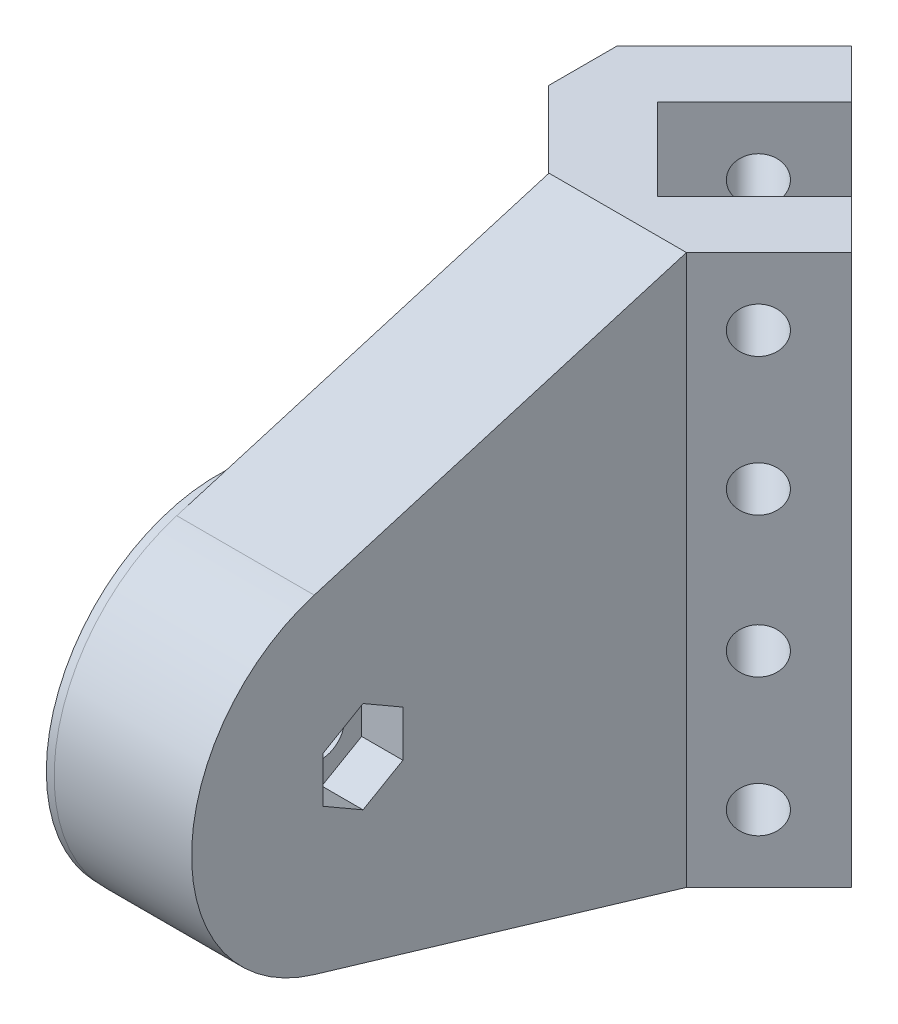
ISO-10303-21;
HEADER;
FILE_DESCRIPTION(('STEP AP214'),'2;1');
FILE_NAME('part.step','',(''),(''),'','','');
FILE_SCHEMA(('AUTOMOTIVE_DESIGN { 1 0 10303 214 1 1 1 1 }'));
ENDSEC;
DATA;
#1=APPLICATION_CONTEXT('core data for automotive mechanical design processes');
#2=APPLICATION_PROTOCOL_DEFINITION('international standard','automotive_design',2000,#1);
#3=PRODUCT_CONTEXT('',#1,'mechanical');
#4=PRODUCT('Part','Part','',(#3));
#5=PRODUCT_RELATED_PRODUCT_CATEGORY('part','',(#4));
#6=PRODUCT_DEFINITION_FORMATION('','',#4);
#7=PRODUCT_DEFINITION_CONTEXT('part definition',#1,'design');
#8=PRODUCT_DEFINITION('design','',#6,#7);
#9=PRODUCT_DEFINITION_SHAPE('','',#8);
#10=(LENGTH_UNIT() NAMED_UNIT(*) SI_UNIT(.MILLI.,.METRE.));
#11=(NAMED_UNIT(*) PLANE_ANGLE_UNIT() SI_UNIT($,.RADIAN.));
#12=(NAMED_UNIT(*) SI_UNIT($,.STERADIAN.) SOLID_ANGLE_UNIT());
#13=UNCERTAINTY_MEASURE_WITH_UNIT(LENGTH_MEASURE(1.E-05),#10,'distance_accuracy_value','');
#14=(GEOMETRIC_REPRESENTATION_CONTEXT(3) GLOBAL_UNCERTAINTY_ASSIGNED_CONTEXT((#13)) GLOBAL_UNIT_ASSIGNED_CONTEXT((#10,
#11,#12)) REPRESENTATION_CONTEXT('',''));
#15=CARTESIAN_POINT('',(0.,0.,0.));
#16=DIRECTION('',(0.,0.,1.));
#17=DIRECTION('',(1.,0.,0.));
#18=AXIS2_PLACEMENT_3D('',#15,#16,#17);
#19=CARTESIAN_POINT('',(250.719484138599,34.9,80.4212229501447));
#20=DIRECTION('',(0.707106781186549,0.,0.707106781186546));
#21=DIRECTION('',(0.707106781186546,0.,-0.707106781186549));
#22=AXIS2_PLACEMENT_3D('',#19,#20,#21);
#23=CYLINDRICAL_SURFACE('',#22,1.65);
#24=CARTESIAN_POINT('',(260.618979075211,34.9,90.3207178867563));
#25=DIRECTION('',(0.707106781186549,0.,0.707106781186546));
#26=DIRECTION('',(0.707106781186546,0.,-0.707106781186549));
#27=AXIS2_PLACEMENT_3D('',#24,#25,#26);
#28=CIRCLE('',#27,1.65);
#29=CARTESIAN_POINT('',(261.785705264169,34.9,89.1539916977985));
#30=VERTEX_POINT('',#29);
#31=EDGE_CURVE('E379',#30,#30,#28,.T.);
#32=ORIENTED_EDGE('',*,*,#31,.F.);
#33=EDGE_LOOP('',(#32));
#34=FACE_BOUND('',#33,.T.);
#35=CARTESIAN_POINT('',(264.154512981144,34.9,93.8562517926891));
#36=DIRECTION('',(0.707106781186549,0.,0.707106781186546));
#37=DIRECTION('',(0.707106781186546,0.,-0.707106781186549));
#38=AXIS2_PLACEMENT_3D('',#35,#36,#37);
#39=CIRCLE('',#38,1.65);
#40=CARTESIAN_POINT('',(265.321239170101,34.9,92.6895256037313));
#41=VERTEX_POINT('',#40);
#42=EDGE_CURVE('E351',#41,#41,#39,.T.);
#43=ORIENTED_EDGE('',*,*,#42,.T.);
#44=EDGE_LOOP('',(#43));
#45=FACE_BOUND('',#44,.T.);
#46=ADVANCED_FACE('F17',(#34,#45),#23,.F.);
#47=CARTESIAN_POINT('',(250.719484138599,44.9,80.4212229501447));
#48=DIRECTION('',(0.707106781186549,0.,0.707106781186546));
#49=DIRECTION('',(0.707106781186546,0.,-0.707106781186549));
#50=AXIS2_PLACEMENT_3D('',#47,#48,#49);
#51=CYLINDRICAL_SURFACE('',#50,1.65);
#52=CARTESIAN_POINT('',(260.618979075211,44.9,90.3207178867563));
#53=DIRECTION('',(0.707106781186549,0.,0.707106781186546));
#54=DIRECTION('',(0.707106781186546,0.,-0.707106781186549));
#55=AXIS2_PLACEMENT_3D('',#52,#53,#54);
#56=CIRCLE('',#55,1.65);
#57=CARTESIAN_POINT('',(261.785705264169,44.9,89.1539916977985));
#58=VERTEX_POINT('',#57);
#59=EDGE_CURVE('E382',#58,#58,#56,.T.);
#60=ORIENTED_EDGE('',*,*,#59,.F.);
#61=EDGE_LOOP('',(#60));
#62=FACE_BOUND('',#61,.T.);
#63=CARTESIAN_POINT('',(264.154512981144,44.9,93.8562517926891));
#64=DIRECTION('',(0.707106781186549,0.,0.707106781186546));
#65=DIRECTION('',(0.707106781186546,0.,-0.707106781186549));
#66=AXIS2_PLACEMENT_3D('',#63,#64,#65);
#67=CIRCLE('',#66,1.65);
#68=CARTESIAN_POINT('',(265.321239170101,44.9,92.6895256037313));
#69=VERTEX_POINT('',#68);
#70=EDGE_CURVE('E347',#69,#69,#67,.T.);
#71=ORIENTED_EDGE('',*,*,#70,.T.);
#72=EDGE_LOOP('',(#71));
#73=FACE_BOUND('',#72,.T.);
#74=ADVANCED_FACE('F630',(#62,#73),#51,.F.);
#75=CARTESIAN_POINT('',(250.719484138599,55.1,80.4212229501447));
#76=DIRECTION('',(0.707106781186549,0.,0.707106781186546));
#77=DIRECTION('',(0.707106781186546,0.,-0.707106781186549));
#78=AXIS2_PLACEMENT_3D('',#75,#76,#77);
#79=CYLINDRICAL_SURFACE('',#78,1.65);
#80=CARTESIAN_POINT('',(260.618979075211,55.1,90.3207178867563));
#81=DIRECTION('',(0.707106781186549,0.,0.707106781186546));
#82=DIRECTION('',(0.707106781186546,0.,-0.707106781186549));
#83=AXIS2_PLACEMENT_3D('',#80,#81,#82);
#84=CIRCLE('',#83,1.65);
#85=CARTESIAN_POINT('',(261.785705264169,55.1,89.1539916977985));
#86=VERTEX_POINT('',#85);
#87=EDGE_CURVE('E451',#86,#86,#84,.T.);
#88=ORIENTED_EDGE('',*,*,#87,.F.);
#89=EDGE_LOOP('',(#88));
#90=FACE_BOUND('',#89,.T.);
#91=CARTESIAN_POINT('',(264.154512981144,55.1,93.8562517926891));
#92=DIRECTION('',(0.707106781186549,0.,0.707106781186546));
#93=DIRECTION('',(0.707106781186546,0.,-0.707106781186549));
#94=AXIS2_PLACEMENT_3D('',#91,#92,#93);
#95=CIRCLE('',#94,1.65);
#96=CARTESIAN_POINT('',(265.321239170101,55.1,92.6895256037313));
#97=VERTEX_POINT('',#96);
#98=EDGE_CURVE('E350',#97,#97,#95,.T.);
#99=ORIENTED_EDGE('',*,*,#98,.T.);
#100=EDGE_LOOP('',(#99));
#101=FACE_BOUND('',#100,.T.);
#102=ADVANCED_FACE('F614',(#90,#101),#79,.F.);
#103=CARTESIAN_POINT('',(250.719484138599,65.1,80.4212229501447));
#104=DIRECTION('',(0.707106781186549,0.,0.707106781186546));
#105=DIRECTION('',(0.707106781186546,0.,-0.707106781186549));
#106=AXIS2_PLACEMENT_3D('',#103,#104,#105);
#107=CYLINDRICAL_SURFACE('',#106,1.65);
#108=CARTESIAN_POINT('',(260.618979075211,65.1,90.3207178867563));
#109=DIRECTION('',(0.707106781186549,0.,0.707106781186546));
#110=DIRECTION('',(0.707106781186546,0.,-0.707106781186549));
#111=AXIS2_PLACEMENT_3D('',#108,#109,#110);
#112=CIRCLE('',#111,1.65);
#113=CARTESIAN_POINT('',(261.785705264169,65.1,89.1539916977985));
#114=VERTEX_POINT('',#113);
#115=EDGE_CURVE('E475',#114,#114,#112,.T.);
#116=ORIENTED_EDGE('',*,*,#115,.F.);
#117=EDGE_LOOP('',(#116));
#118=FACE_BOUND('',#117,.T.);
#119=CARTESIAN_POINT('',(264.154512981144,65.1,93.8562517926891));
#120=DIRECTION('',(0.707106781186549,0.,0.707106781186546));
#121=DIRECTION('',(0.707106781186546,0.,-0.707106781186549));
#122=AXIS2_PLACEMENT_3D('',#119,#120,#121);
#123=CIRCLE('',#122,1.65);
#124=CARTESIAN_POINT('',(265.321239170101,65.1,92.6895256037313));
#125=VERTEX_POINT('',#124);
#126=EDGE_CURVE('E414',#125,#125,#123,.T.);
#127=ORIENTED_EDGE('',*,*,#126,.T.);
#128=EDGE_LOOP('',(#127));
#129=FACE_BOUND('',#128,.T.);
#130=ADVANCED_FACE('F610',(#118,#129),#107,.F.);
#131=CARTESIAN_POINT('',(250.719484138599,34.9,80.4212229501447));
#132=DIRECTION('',(0.707106781186549,0.,0.707106781186546));
#133=DIRECTION('',(0.707106781186546,0.,-0.707106781186549));
#134=AXIS2_PLACEMENT_3D('',#131,#132,#133);
#135=CYLINDRICAL_SURFACE('',#134,1.65);
#136=CARTESIAN_POINT('',(254.679282113244,34.9,84.3810209247893));
#137=DIRECTION('',(-0.707106781186549,0.,-0.707106781186546));
#138=DIRECTION('',(-0.707106781186546,0.,0.707106781186549));
#139=AXIS2_PLACEMENT_3D('',#136,#137,#138);
#140=CIRCLE('',#139,1.65);
#141=CARTESIAN_POINT('',(253.512555924286,34.9,85.5477471137471));
#142=VERTEX_POINT('',#141);
#143=EDGE_CURVE('E21',#142,#142,#140,.T.);
#144=ORIENTED_EDGE('',*,*,#143,.F.);
#145=EDGE_LOOP('',(#144));
#146=FACE_BOUND('',#145,.T.);
#147=CARTESIAN_POINT('',(251.143748207311,34.9,80.8454870188566));
#148=DIRECTION('',(0.707106781186548,0.,0.707106781186547));
#149=DIRECTION('',(0.707106781186547,0.,-0.707106781186548));
#150=AXIS2_PLACEMENT_3D('',#147,#148,#149);
#151=CIRCLE('',#150,1.65);
#152=CARTESIAN_POINT('',(252.310474396269,34.9,79.6787608298988));
#153=VERTEX_POINT('',#152);
#154=EDGE_CURVE('E440',#153,#153,#151,.T.);
#155=ORIENTED_EDGE('',*,*,#154,.F.);
#156=EDGE_LOOP('',(#155));
#157=FACE_BOUND('',#156,.T.);
#158=ADVANCED_FACE('F613',(#146,#157),#135,.F.);
#159=CARTESIAN_POINT('',(250.719484138599,44.9,80.4212229501447));
#160=DIRECTION('',(0.707106781186549,0.,0.707106781186546));
#161=DIRECTION('',(0.707106781186546,0.,-0.707106781186549));
#162=AXIS2_PLACEMENT_3D('',#159,#160,#161);
#163=CYLINDRICAL_SURFACE('',#162,1.65);
#164=CARTESIAN_POINT('',(254.679282113244,44.9,84.3810209247893));
#165=DIRECTION('',(-0.707106781186549,0.,-0.707106781186546));
#166=DIRECTION('',(-0.707106781186546,0.,0.707106781186549));
#167=AXIS2_PLACEMENT_3D('',#164,#165,#166);
#168=CIRCLE('',#167,1.65);
#169=CARTESIAN_POINT('',(253.512555924286,44.9,85.5477471137471));
#170=VERTEX_POINT('',#169);
#171=EDGE_CURVE('E384',#170,#170,#168,.T.);
#172=ORIENTED_EDGE('',*,*,#171,.F.);
#173=EDGE_LOOP('',(#172));
#174=FACE_BOUND('',#173,.T.);
#175=CARTESIAN_POINT('',(251.143748207311,44.9,80.8454870188566));
#176=DIRECTION('',(0.707106781186548,0.,0.707106781186547));
#177=DIRECTION('',(0.707106781186547,0.,-0.707106781186548));
#178=AXIS2_PLACEMENT_3D('',#175,#176,#177);
#179=CIRCLE('',#178,1.65);
#180=CARTESIAN_POINT('',(252.310474396269,44.9,79.6787608298988));
#181=VERTEX_POINT('',#180);
#182=EDGE_CURVE('E436',#181,#181,#179,.T.);
#183=ORIENTED_EDGE('',*,*,#182,.F.);
#184=EDGE_LOOP('',(#183));
#185=FACE_BOUND('',#184,.T.);
#186=ADVANCED_FACE('F698',(#174,#185),#163,.F.);
#187=CARTESIAN_POINT('',(250.719484138599,55.1,80.4212229501447));
#188=DIRECTION('',(0.707106781186549,0.,0.707106781186546));
#189=DIRECTION('',(0.707106781186546,0.,-0.707106781186549));
#190=AXIS2_PLACEMENT_3D('',#187,#188,#189);
#191=CYLINDRICAL_SURFACE('',#190,1.65);
#192=CARTESIAN_POINT('',(254.679282113244,55.1,84.3810209247893));
#193=DIRECTION('',(-0.707106781186549,0.,-0.707106781186546));
#194=DIRECTION('',(-0.707106781186546,0.,0.707106781186549));
#195=AXIS2_PLACEMENT_3D('',#192,#193,#194);
#196=CIRCLE('',#195,1.65);
#197=CARTESIAN_POINT('',(253.512555924286,55.1,85.5477471137471));
#198=VERTEX_POINT('',#197);
#199=EDGE_CURVE('E387',#198,#198,#196,.T.);
#200=ORIENTED_EDGE('',*,*,#199,.F.);
#201=EDGE_LOOP('',(#200));
#202=FACE_BOUND('',#201,.T.);
#203=CARTESIAN_POINT('',(251.143748207311,55.1,80.8454870188566));
#204=DIRECTION('',(0.707106781186548,0.,0.707106781186547));
#205=DIRECTION('',(0.707106781186547,0.,-0.707106781186548));
#206=AXIS2_PLACEMENT_3D('',#203,#204,#205);
#207=CIRCLE('',#206,1.65);
#208=CARTESIAN_POINT('',(252.310474396269,55.1,79.6787608298988));
#209=VERTEX_POINT('',#208);
#210=EDGE_CURVE('E439',#209,#209,#207,.T.);
#211=ORIENTED_EDGE('',*,*,#210,.F.);
#212=EDGE_LOOP('',(#211));
#213=FACE_BOUND('',#212,.T.);
#214=ADVANCED_FACE('F712',(#202,#213),#191,.F.);
#215=CARTESIAN_POINT('',(250.719484138599,65.1,80.4212229501447));
#216=DIRECTION('',(0.707106781186549,0.,0.707106781186546));
#217=DIRECTION('',(0.707106781186546,0.,-0.707106781186549));
#218=AXIS2_PLACEMENT_3D('',#215,#216,#217);
#219=CYLINDRICAL_SURFACE('',#218,1.65);
#220=CARTESIAN_POINT('',(254.679282113244,65.1,84.3810209247893));
#221=DIRECTION('',(-0.707106781186549,0.,-0.707106781186546));
#222=DIRECTION('',(-0.707106781186546,0.,0.707106781186549));
#223=AXIS2_PLACEMENT_3D('',#220,#221,#222);
#224=CIRCLE('',#223,1.65);
#225=CARTESIAN_POINT('',(253.512555924286,65.1,85.5477471137471));
#226=VERTEX_POINT('',#225);
#227=EDGE_CURVE('E398',#226,#226,#224,.T.);
#228=ORIENTED_EDGE('',*,*,#227,.F.);
#229=EDGE_LOOP('',(#228));
#230=FACE_BOUND('',#229,.T.);
#231=CARTESIAN_POINT('',(251.143748207311,65.1,80.8454870188566));
#232=DIRECTION('',(0.707106781186548,0.,0.707106781186547));
#233=DIRECTION('',(0.707106781186547,0.,-0.707106781186548));
#234=AXIS2_PLACEMENT_3D('',#231,#232,#233);
#235=CIRCLE('',#234,1.65);
#236=CARTESIAN_POINT('',(252.310474396269,65.1,79.6787608298988));
#237=VERTEX_POINT('',#236);
#238=EDGE_CURVE('E512',#237,#237,#235,.T.);
#239=ORIENTED_EDGE('',*,*,#238,.F.);
#240=EDGE_LOOP('',(#239));
#241=FACE_BOUND('',#240,.T.);
#242=ADVANCED_FACE('F714',(#230,#241),#219,.F.);
#243=CARTESIAN_POINT('',(258.537860757007,52.5114736709749,118.55));
#244=DIRECTION('',(0.,0.866025403784438,-0.5));
#245=DIRECTION('',(-1.,0.,0.));
#246=AXIS2_PLACEMENT_3D('',#243,#244,#245);
#247=PLANE('',#246);
#248=DIRECTION('',(0.,0.5,0.866025403784438));
#249=VECTOR('',#248,1.);
#250=CARTESIAN_POINT('',(261.537860757007,52.5114736709749,118.55));
#251=LINE('',#250,#249);
#252=CARTESIAN_POINT('',(261.537860757007,51.6743157806499,117.1));
#253=VERTEX_POINT('',#252);
#254=CARTESIAN_POINT('',(261.537860757007,53.3486315612998,120.));
#255=VERTEX_POINT('',#254);
#256=EDGE_CURVE('E404',#253,#255,#251,.T.);
#257=ORIENTED_EDGE('',*,*,#256,.T.);
#258=DIRECTION('',(1.,0.,0.));
#259=VECTOR('',#258,1.);
#260=CARTESIAN_POINT('',(258.537860757007,53.3486315612998,120.));
#261=LINE('',#260,#259);
#262=CARTESIAN_POINT('',(258.537860757007,53.3486315612998,120.));
#263=VERTEX_POINT('',#262);
#264=EDGE_CURVE('E187',#263,#255,#261,.T.);
#265=ORIENTED_EDGE('',*,*,#264,.F.);
#266=DIRECTION('',(0.,0.5,0.866025403784438));
#267=VECTOR('',#266,1.);
#268=CARTESIAN_POINT('',(258.537860757007,52.5114736709749,118.55));
#269=LINE('',#268,#267);
#270=CARTESIAN_POINT('',(258.537860757007,51.6743157806499,117.1));
#271=VERTEX_POINT('',#270);
#272=EDGE_CURVE('E354',#271,#263,#269,.T.);
#273=ORIENTED_EDGE('',*,*,#272,.F.);
#274=DIRECTION('',(1.,0.,0.));
#275=VECTOR('',#274,1.);
#276=CARTESIAN_POINT('',(258.537860757007,51.6743157806499,117.1));
#277=LINE('',#276,#275);
#278=EDGE_CURVE('E11',#271,#253,#277,.T.);
#279=ORIENTED_EDGE('',*,*,#278,.T.);
#280=EDGE_LOOP('',(#257,#265,#273,#279));
#281=FACE_BOUND('',#280,.T.);
#282=ADVANCED_FACE('F19',(#281),#247,.F.);
#283=CARTESIAN_POINT('',(258.537860757007,50.,117.1));
#284=DIRECTION('',(0.,0.,-1.));
#285=DIRECTION('',(0.,-1.,0.));
#286=AXIS2_PLACEMENT_3D('',#283,#284,#285);
#287=PLANE('',#286);
#288=DIRECTION('',(0.,1.,0.));
#289=VECTOR('',#288,1.);
#290=CARTESIAN_POINT('',(261.537860757007,50.,117.1));
#291=LINE('',#290,#289);
#292=CARTESIAN_POINT('',(261.537860757007,48.3256842193501,117.1));
#293=VERTEX_POINT('',#292);
#294=EDGE_CURVE('E407',#293,#253,#291,.T.);
#295=ORIENTED_EDGE('',*,*,#294,.T.);
#296=ORIENTED_EDGE('',*,*,#278,.F.);
#297=DIRECTION('',(0.,1.,0.));
#298=VECTOR('',#297,1.);
#299=CARTESIAN_POINT('',(258.537860757007,50.,117.1));
#300=LINE('',#299,#298);
#301=CARTESIAN_POINT('',(258.537860757007,48.3256842193501,117.1));
#302=VERTEX_POINT('',#301);
#303=EDGE_CURVE('E356',#302,#271,#300,.T.);
#304=ORIENTED_EDGE('',*,*,#303,.F.);
#305=DIRECTION('',(1.,0.,0.));
#306=VECTOR('',#305,1.);
#307=CARTESIAN_POINT('',(258.537860757007,48.3256842193501,117.1));
#308=LINE('',#307,#306);
#309=EDGE_CURVE('E28',#302,#293,#308,.T.);
#310=ORIENTED_EDGE('',*,*,#309,.T.);
#311=EDGE_LOOP('',(#295,#296,#304,#310));
#312=FACE_BOUND('',#311,.T.);
#313=ADVANCED_FACE('F688',(#312),#287,.F.);
#314=CARTESIAN_POINT('',(258.537860757007,47.4885263290251,118.55));
#315=DIRECTION('',(0.,-0.866025403784439,-0.5));
#316=DIRECTION('',(0.,0.5,-0.866025403784439));
#317=AXIS2_PLACEMENT_3D('',#314,#315,#316);
#318=PLANE('',#317);
#319=DIRECTION('',(0.,0.5,-0.866025403784439));
#320=VECTOR('',#319,1.);
#321=CARTESIAN_POINT('',(261.537860757007,47.4885263290251,118.55));
#322=LINE('',#321,#320);
#323=CARTESIAN_POINT('',(261.537860757007,46.6513684387002,120.));
#324=VERTEX_POINT('',#323);
#325=EDGE_CURVE('E535',#324,#293,#322,.T.);
#326=ORIENTED_EDGE('',*,*,#325,.T.);
#327=ORIENTED_EDGE('',*,*,#309,.F.);
#328=DIRECTION('',(0.,0.5,-0.866025403784439));
#329=VECTOR('',#328,1.);
#330=CARTESIAN_POINT('',(258.537860757007,47.4885263290251,118.55));
#331=LINE('',#330,#329);
#332=CARTESIAN_POINT('',(258.537860757007,46.6513684387002,120.));
#333=VERTEX_POINT('',#332);
#334=EDGE_CURVE('E402',#333,#302,#331,.T.);
#335=ORIENTED_EDGE('',*,*,#334,.F.);
#336=DIRECTION('',(1.,0.,0.));
#337=VECTOR('',#336,1.);
#338=CARTESIAN_POINT('',(258.537860757007,46.6513684387002,120.));
#339=LINE('',#338,#337);
#340=EDGE_CURVE('E119',#333,#324,#339,.T.);
#341=ORIENTED_EDGE('',*,*,#340,.T.);
#342=EDGE_LOOP('',(#326,#327,#335,#341));
#343=FACE_BOUND('',#342,.T.);
#344=ADVANCED_FACE('F691',(#343),#318,.F.);
#345=CARTESIAN_POINT('',(258.537860757007,47.4885263290251,121.45));
#346=DIRECTION('',(0.,-0.866025403784438,0.5));
#347=DIRECTION('',(-1.,0.,0.));
#348=AXIS2_PLACEMENT_3D('',#345,#346,#347);
#349=PLANE('',#348);
#350=DIRECTION('',(0.,-0.5,-0.866025403784438));
#351=VECTOR('',#350,1.);
#352=CARTESIAN_POINT('',(261.537860757007,47.4885263290251,121.45));
#353=LINE('',#352,#351);
#354=CARTESIAN_POINT('',(261.537860757007,48.3256842193501,122.9));
#355=VERTEX_POINT('',#354);
#356=EDGE_CURVE('E467',#355,#324,#353,.T.);
#357=ORIENTED_EDGE('',*,*,#356,.T.);
#358=ORIENTED_EDGE('',*,*,#340,.F.);
#359=DIRECTION('',(0.,-0.5,-0.866025403784438));
#360=VECTOR('',#359,1.);
#361=CARTESIAN_POINT('',(258.537860757007,47.4885263290251,121.45));
#362=LINE('',#361,#360);
#363=CARTESIAN_POINT('',(258.537860757007,48.3256842193501,122.9));
#364=VERTEX_POINT('',#363);
#365=EDGE_CURVE('E399',#364,#333,#362,.T.);
#366=ORIENTED_EDGE('',*,*,#365,.F.);
#367=DIRECTION('',(1.,0.,0.));
#368=VECTOR('',#367,1.);
#369=CARTESIAN_POINT('',(258.537860757007,48.3256842193501,122.9));
#370=LINE('',#369,#368);
#371=EDGE_CURVE('E277',#364,#355,#370,.T.);
#372=ORIENTED_EDGE('',*,*,#371,.T.);
#373=EDGE_LOOP('',(#357,#358,#366,#372));
#374=FACE_BOUND('',#373,.T.);
#375=ADVANCED_FACE('F672',(#374),#349,.F.);
#376=CARTESIAN_POINT('',(258.537860757007,50.,122.9));
#377=DIRECTION('',(0.,0.,1.));
#378=DIRECTION('',(1.,0.,0.));
#379=AXIS2_PLACEMENT_3D('',#376,#377,#378);
#380=PLANE('',#379);
#381=DIRECTION('',(0.,-1.,0.));
#382=VECTOR('',#381,1.);
#383=CARTESIAN_POINT('',(261.537860757007,50.,122.9));
#384=LINE('',#383,#382);
#385=CARTESIAN_POINT('',(261.537860757007,51.6743157806499,122.9));
#386=VERTEX_POINT('',#385);
#387=EDGE_CURVE('E417',#386,#355,#384,.T.);
#388=ORIENTED_EDGE('',*,*,#387,.T.);
#389=ORIENTED_EDGE('',*,*,#371,.F.);
#390=DIRECTION('',(0.,-1.,0.));
#391=VECTOR('',#390,1.);
#392=CARTESIAN_POINT('',(258.537860757007,50.,122.9));
#393=LINE('',#392,#391);
#394=CARTESIAN_POINT('',(258.537860757007,51.6743157806499,122.9));
#395=VERTEX_POINT('',#394);
#396=EDGE_CURVE('E372',#395,#364,#393,.T.);
#397=ORIENTED_EDGE('',*,*,#396,.F.);
#398=DIRECTION('',(1.,0.,0.));
#399=VECTOR('',#398,1.);
#400=CARTESIAN_POINT('',(258.537860757007,51.6743157806499,122.9));
#401=LINE('',#400,#399);
#402=EDGE_CURVE('E175',#395,#386,#401,.T.);
#403=ORIENTED_EDGE('',*,*,#402,.T.);
#404=EDGE_LOOP('',(#388,#389,#397,#403));
#405=FACE_BOUND('',#404,.T.);
#406=ADVANCED_FACE('F669',(#405),#380,.F.);
#407=CARTESIAN_POINT('',(258.537860757007,52.5114736709749,121.45));
#408=DIRECTION('',(0.,0.866025403784439,0.5));
#409=DIRECTION('',(1.,0.,0.));
#410=AXIS2_PLACEMENT_3D('',#407,#408,#409);
#411=PLANE('',#410);
#412=DIRECTION('',(0.,-0.5,0.866025403784439));
#413=VECTOR('',#412,1.);
#414=CARTESIAN_POINT('',(261.537860757007,52.5114736709749,121.45));
#415=LINE('',#414,#413);
#416=EDGE_CURVE('E408',#255,#386,#415,.T.);
#417=ORIENTED_EDGE('',*,*,#416,.T.);
#418=ORIENTED_EDGE('',*,*,#402,.F.);
#419=DIRECTION('',(0.,-0.5,0.866025403784439));
#420=VECTOR('',#419,1.);
#421=CARTESIAN_POINT('',(258.537860757007,52.5114736709749,121.45));
#422=LINE('',#421,#420);
#423=EDGE_CURVE('E368',#263,#395,#422,.T.);
#424=ORIENTED_EDGE('',*,*,#423,.F.);
#425=ORIENTED_EDGE('',*,*,#264,.T.);
#426=EDGE_LOOP('',(#417,#418,#424,#425));
#427=FACE_BOUND('',#426,.T.);
#428=ADVANCED_FACE('F654',(#427),#411,.F.);
#429=CARTESIAN_POINT('',(258.537860757007,50.,114.472904016826));
#430=DIRECTION('',(1.,0.,0.));
#431=DIRECTION('',(0.,1.,0.));
#432=AXIS2_PLACEMENT_3D('',#429,#430,#431);
#433=PLANE('',#432);
#434=CARTESIAN_POINT('',(258.537860757007,50.,120.));
#435=DIRECTION('',(-1.,0.,0.));
#436=DIRECTION('',(0.,0.,-1.));
#437=AXIS2_PLACEMENT_3D('',#434,#435,#436);
#438=CIRCLE('',#437,1.65);
#439=CARTESIAN_POINT('',(258.537860757007,50.,118.35));
#440=VERTEX_POINT('',#439);
#441=EDGE_CURVE('E332',#440,#440,#438,.T.);
#442=ORIENTED_EDGE('',*,*,#441,.T.);
#443=EDGE_LOOP('',(#442));
#444=FACE_BOUND('',#443,.T.);
#445=ORIENTED_EDGE('',*,*,#423,.T.);
#446=ORIENTED_EDGE('',*,*,#396,.T.);
#447=ORIENTED_EDGE('',*,*,#365,.T.);
#448=ORIENTED_EDGE('',*,*,#334,.T.);
#449=ORIENTED_EDGE('',*,*,#303,.T.);
#450=ORIENTED_EDGE('',*,*,#272,.T.);
#451=EDGE_LOOP('',(#445,#446,#447,#448,#449,#450));
#452=FACE_BOUND('',#451,.T.);
#453=ADVANCED_FACE('F650',(#444,#452),#433,.T.);
#454=CARTESIAN_POINT('',(250.937860757007,50.,114.497673148926));
#455=DIRECTION('',(-1.,0.,0.));
#456=DIRECTION('',(0.,0.,1.));
#457=AXIS2_PLACEMENT_3D('',#454,#455,#456);
#458=PLANE('',#457);
#459=CARTESIAN_POINT('',(250.937860757007,50.,120.));
#460=DIRECTION('',(-1.,0.,0.));
#461=DIRECTION('',(0.,0.,1.));
#462=AXIS2_PLACEMENT_3D('',#459,#460,#461);
#463=CIRCLE('',#462,12.4407289921999);
#464=CARTESIAN_POINT('',(250.937860757007,50.,132.4407289922));
#465=VERTEX_POINT('',#464);
#466=EDGE_CURVE('E373',#465,#465,#463,.T.);
#467=ORIENTED_EDGE('',*,*,#466,.T.);
#468=EDGE_LOOP('',(#467));
#469=FACE_BOUND('',#468,.T.);
#470=CARTESIAN_POINT('',(250.937860757007,50.,120.));
#471=DIRECTION('',(-1.,0.,0.));
#472=DIRECTION('',(0.,0.,1.));
#473=AXIS2_PLACEMENT_3D('',#470,#471,#472);
#474=CIRCLE('',#473,1.65);
#475=CARTESIAN_POINT('',(250.937860757007,50.,121.65));
#476=VERTEX_POINT('',#475);
#477=EDGE_CURVE('E338',#476,#476,#474,.T.);
#478=ORIENTED_EDGE('',*,*,#477,.F.);
#479=EDGE_LOOP('',(#478));
#480=FACE_BOUND('',#479,.T.);
#481=ADVANCED_FACE('F653',(#469,#480),#458,.T.);
#482=CARTESIAN_POINT('',(250.937860757007,50.,120.));
#483=DIRECTION('',(1.,0.,0.));
#484=DIRECTION('',(0.,0.,-1.));
#485=AXIS2_PLACEMENT_3D('',#482,#483,#484);
#486=CYLINDRICAL_SURFACE('',#485,12.4407289921999);
#487=CARTESIAN_POINT('',(251.537860757007,50.,120.));
#488=DIRECTION('',(-1.,0.,0.));
#489=DIRECTION('',(0.,0.,1.));
#490=AXIS2_PLACEMENT_3D('',#487,#488,#489);
#491=CIRCLE('',#490,12.4407289921999);
#492=CARTESIAN_POINT('',(251.537860757007,50.,132.4407289922));
#493=VERTEX_POINT('',#492);
#494=EDGE_CURVE('E456',#493,#493,#491,.T.);
#495=ORIENTED_EDGE('',*,*,#494,.T.);
#496=EDGE_LOOP('',(#495));
#497=FACE_BOUND('',#496,.T.);
#498=ORIENTED_EDGE('',*,*,#466,.F.);
#499=EDGE_LOOP('',(#498));
#500=FACE_BOUND('',#499,.T.);
#501=ADVANCED_FACE('F649',(#497,#500),#486,.T.);
#502=CARTESIAN_POINT('',(236.537860757007,65.9782873032583,110.012237629748));
#503=DIRECTION('',(0.,0.958603913762746,0.284742930586075));
#504=DIRECTION('',(1.,0.,0.));
#505=AXIS2_PLACEMENT_3D('',#502,#503,#504);
#506=PLANE('',#505);
#507=DIRECTION('',(0.692007175158167,-0.205553251152171,0.692007175158167));
#508=VECTOR('',#507,1.);
#509=CARTESIAN_POINT('',(247.927196919652,71.0577938576369,92.9117784436719));
#510=LINE('',#509,#508);
#511=CARTESIAN_POINT('',(251.488322492806,70.,96.4729040168261));
#512=VERTEX_POINT('',#511);
#513=CARTESIAN_POINT('',(251.537860757007,69.9852851941015,96.5224422810265));
#514=VERTEX_POINT('',#513);
#515=EDGE_CURVE('E305',#512,#514,#510,.T.);
#516=ORIENTED_EDGE('',*,*,#515,.T.);
#517=DIRECTION('',(0.,0.284742930586075,-0.958603913762746));
#518=VECTOR('',#517,1.);
#519=CARTESIAN_POINT('',(251.537860757007,65.0800367463449,113.036251246607));
#520=LINE('',#519,#518);
#521=CARTESIAN_POINT('',(251.537860757007,61.9565746065166,123.55157124267));
#522=VERTEX_POINT('',#521);
#523=EDGE_CURVE('E343',#522,#514,#520,.T.);
#524=ORIENTED_EDGE('',*,*,#523,.F.);
#525=DIRECTION('',(1.,0.,0.));
#526=VECTOR('',#525,1.);
#527=CARTESIAN_POINT('',(236.537860757007,61.9565746065166,123.55157124267));
#528=LINE('',#527,#526);
#529=CARTESIAN_POINT('',(261.537860757007,61.9565746065166,123.55157124267));
#530=VERTEX_POINT('',#529);
#531=EDGE_CURVE('E520',#522,#530,#528,.T.);
#532=ORIENTED_EDGE('',*,*,#531,.T.);
#533=DIRECTION('',(0.,-0.284742930586075,0.958603913762746));
#534=VECTOR('',#533,1.);
#535=CARTESIAN_POINT('',(261.537860757007,65.9782873032583,110.012237629748));
#536=LINE('',#535,#534);
#537=CARTESIAN_POINT('',(261.537860757007,70.,96.4729040168261));
#538=VERTEX_POINT('',#537);
#539=EDGE_CURVE('E307',#538,#530,#536,.T.);
#540=ORIENTED_EDGE('',*,*,#539,.F.);
#541=DIRECTION('',(1.,0.,0.));
#542=VECTOR('',#541,1.);
#543=CARTESIAN_POINT('',(236.537860757007,70.,96.4729040168261));
#544=LINE('',#543,#542);
#545=EDGE_CURVE('E300',#512,#538,#544,.T.);
#546=ORIENTED_EDGE('',*,*,#545,.F.);
#547=EDGE_LOOP('',(#516,#524,#532,#540,#546));
#548=FACE_BOUND('',#547,.T.);
#549=ADVANCED_FACE('F302',(#548),#506,.T.);
#550=CARTESIAN_POINT('',(236.537860757007,50.,120.));
#551=DIRECTION('',(1.,0.,0.));
#552=DIRECTION('',(0.,0.,-1.));
#553=AXIS2_PLACEMENT_3D('',#550,#551,#552);
#554=CYLINDRICAL_SURFACE('',#553,12.4729040168261);
#555=DIRECTION('',(1.,0.,0.));
#556=VECTOR('',#555,1.);
#557=CARTESIAN_POINT('',(236.537860757007,38.0434253934835,123.55157124267));
#558=LINE('',#557,#556);
#559=CARTESIAN_POINT('',(251.537860757007,38.0434253934835,123.55157124267));
#560=VERTEX_POINT('',#559);
#561=CARTESIAN_POINT('',(261.537860757007,38.0434253934835,123.55157124267));
#562=VERTEX_POINT('',#561);
#563=EDGE_CURVE('E517',#560,#562,#558,.T.);
#564=ORIENTED_EDGE('',*,*,#563,.T.);
#565=CARTESIAN_POINT('',(261.537860757007,50.,120.));
#566=DIRECTION('',(1.,0.,0.));
#567=DIRECTION('',(0.,0.,-1.));
#568=AXIS2_PLACEMENT_3D('',#565,#566,#567);
#569=CIRCLE('',#568,12.4729040168261);
#570=EDGE_CURVE('E421',#530,#562,#569,.T.);
#571=ORIENTED_EDGE('',*,*,#570,.F.);
#572=ORIENTED_EDGE('',*,*,#531,.F.);
#573=CARTESIAN_POINT('',(251.537860757007,50.,120.));
#574=DIRECTION('',(-1.,0.,0.));
#575=DIRECTION('',(0.,0.,1.));
#576=AXIS2_PLACEMENT_3D('',#573,#574,#575);
#577=CIRCLE('',#576,12.4729040168261);
#578=EDGE_CURVE('E346',#560,#522,#577,.T.);
#579=ORIENTED_EDGE('',*,*,#578,.F.);
#580=EDGE_LOOP('',(#564,#571,#572,#579));
#581=FACE_BOUND('',#580,.T.);
#582=ADVANCED_FACE('F648',(#581),#554,.T.);
#583=CARTESIAN_POINT('',(236.537860757007,34.0217126967417,110.012237629748));
#584=DIRECTION('',(0.,0.958603913762746,-0.284742930586075));
#585=DIRECTION('',(-1.,0.,0.));
#586=AXIS2_PLACEMENT_3D('',#583,#584,#585);
#587=PLANE('',#586);
#588=DIRECTION('',(1.,0.,0.));
#589=VECTOR('',#588,1.);
#590=CARTESIAN_POINT('',(236.537860757007,30.,96.4729040168261));
#591=LINE('',#590,#589);
#592=CARTESIAN_POINT('',(251.488322492806,30.,96.4729040168261));
#593=VERTEX_POINT('',#592);
#594=CARTESIAN_POINT('',(261.537860757007,30.,96.4729040168261));
#595=VERTEX_POINT('',#594);
#596=EDGE_CURVE('E448',#593,#595,#591,.T.);
#597=ORIENTED_EDGE('',*,*,#596,.T.);
#598=DIRECTION('',(0.,0.284742930586075,0.958603913762746));
#599=VECTOR('',#598,1.);
#600=CARTESIAN_POINT('',(261.537860757007,34.0217126967417,110.012237629748));
#601=LINE('',#600,#599);
#602=EDGE_CURVE('E425',#595,#562,#601,.T.);
#603=ORIENTED_EDGE('',*,*,#602,.T.);
#604=ORIENTED_EDGE('',*,*,#563,.F.);
#605=DIRECTION('',(0.,-0.284742930586075,-0.958603913762746));
#606=VECTOR('',#605,1.);
#607=CARTESIAN_POINT('',(251.537860757007,38.1631047144049,123.954478753651));
#608=LINE('',#607,#606);
#609=CARTESIAN_POINT('',(251.537860757007,30.0147148058985,96.5224422810265));
#610=VERTEX_POINT('',#609);
#611=EDGE_CURVE('E313',#560,#610,#608,.T.);
#612=ORIENTED_EDGE('',*,*,#611,.T.);
#613=DIRECTION('',(0.692007175158167,0.20555325115217,0.692007175158167));
#614=VECTOR('',#613,1.);
#615=CARTESIAN_POINT('',(253.616969906628,30.6322917047322,98.6015514306475));
#616=LINE('',#615,#614);
#617=EDGE_CURVE('E367',#593,#610,#616,.T.);
#618=ORIENTED_EDGE('',*,*,#617,.F.);
#619=EDGE_LOOP('',(#597,#603,#604,#612,#618));
#620=FACE_BOUND('',#619,.T.);
#621=ADVANCED_FACE('F663',(#620),#587,.F.);
#622=CARTESIAN_POINT('',(246.002326851074,70.,88.4869083750938));
#623=DIRECTION('',(1.,0.,0.));
#624=DIRECTION('',(0.,1.,0.));
#625=AXIS2_PLACEMENT_3D('',#622,#623,#624);
#626=PLANE('',#625);
#627=DIRECTION('',(0.,0.,1.));
#628=VECTOR('',#627,1.);
#629=CARTESIAN_POINT('',(246.002326851074,30.,88.4869083750938));
#630=LINE('',#629,#628);
#631=CARTESIAN_POINT('',(246.002326851074,30.,85.9869083750938));
#632=VERTEX_POINT('',#631);
#633=CARTESIAN_POINT('',(246.002326851074,30.,90.9869083750938));
#634=VERTEX_POINT('',#633);
#635=EDGE_CURVE('E378',#632,#634,#630,.T.);
#636=ORIENTED_EDGE('',*,*,#635,.T.);
#637=DIRECTION('',(0.,-1.,0.));
#638=VECTOR('',#637,1.);
#639=CARTESIAN_POINT('',(246.002326851074,70.,90.9869083750938));
#640=LINE('',#639,#638);
#641=CARTESIAN_POINT('',(246.002326851074,70.,90.9869083750938));
#642=VERTEX_POINT('',#641);
#643=EDGE_CURVE('E324',#642,#634,#640,.T.);
#644=ORIENTED_EDGE('',*,*,#643,.F.);
#645=DIRECTION('',(0.,0.,1.));
#646=VECTOR('',#645,1.);
#647=CARTESIAN_POINT('',(246.002326851074,70.,88.4869083750938));
#648=LINE('',#647,#646);
#649=CARTESIAN_POINT('',(246.002326851074,70.,85.9869083750938));
#650=VERTEX_POINT('',#649);
#651=EDGE_CURVE('E319',#650,#642,#648,.T.);
#652=ORIENTED_EDGE('',*,*,#651,.F.);
#653=DIRECTION('',(0.,-1.,0.));
#654=VECTOR('',#653,1.);
#655=CARTESIAN_POINT('',(246.002326851074,70.,85.9869083750938));
#656=LINE('',#655,#654);
#657=EDGE_CURVE('E288',#650,#632,#656,.T.);
#658=ORIENTED_EDGE('',*,*,#657,.T.);
#659=EDGE_LOOP('',(#636,#644,#652,#658));
#660=FACE_BOUND('',#659,.T.);
#661=ADVANCED_FACE('F668',(#660),#626,.F.);
#662=CARTESIAN_POINT('',(250.27009380404,70.,81.7191414221275));
#663=DIRECTION('',(0.707106781186548,0.,0.707106781186547));
#664=DIRECTION('',(0.,-1.,0.));
#665=AXIS2_PLACEMENT_3D('',#662,#663,#664);
#666=PLANE('',#665);
#667=DIRECTION('',(-0.707106781186547,0.,0.707106781186548));
#668=VECTOR('',#667,1.);
#669=CARTESIAN_POINT('',(250.27009380404,30.,81.7191414221275));
#670=LINE('',#669,#668);
#671=CARTESIAN_POINT('',(254.537860757007,30.,77.4513744691612));
#672=VERTEX_POINT('',#671);
#673=EDGE_CURVE('E374',#672,#632,#670,.T.);
#674=ORIENTED_EDGE('',*,*,#673,.T.);
#675=ORIENTED_EDGE('',*,*,#657,.F.);
#676=DIRECTION('',(-0.707106781186547,0.,0.707106781186548));
#677=VECTOR('',#676,1.);
#678=CARTESIAN_POINT('',(250.27009380404,70.,81.7191414221275));
#679=LINE('',#678,#677);
#680=CARTESIAN_POINT('',(254.537860757007,70.,77.4513744691612));
#681=VERTEX_POINT('',#680);
#682=EDGE_CURVE('E478',#681,#650,#679,.T.);
#683=ORIENTED_EDGE('',*,*,#682,.F.);
#684=DIRECTION('',(0.,-1.,0.));
#685=VECTOR('',#684,1.);
#686=CARTESIAN_POINT('',(254.537860757007,70.,77.4513744691612));
#687=LINE('',#686,#685);
#688=EDGE_CURVE('E397',#681,#672,#687,.T.);
#689=ORIENTED_EDGE('',*,*,#688,.T.);
#690=EDGE_LOOP('',(#674,#675,#683,#689));
#691=FACE_BOUND('',#690,.T.);
#692=ORIENTED_EDGE('',*,*,#238,.T.);
#693=EDGE_LOOP('',(#692));
#694=FACE_BOUND('',#693,.T.);
#695=ORIENTED_EDGE('',*,*,#210,.T.);
#696=EDGE_LOOP('',(#695));
#697=FACE_BOUND('',#696,.T.);
#698=ORIENTED_EDGE('',*,*,#182,.T.);
#699=EDGE_LOOP('',(#698));
#700=FACE_BOUND('',#699,.T.);
#701=ORIENTED_EDGE('',*,*,#154,.T.);
#702=EDGE_LOOP('',(#701));
#703=FACE_BOUND('',#702,.T.);
#704=ADVANCED_FACE('F665',(#691,#694,#697,#700,#703),#666,.F.);
#705=CARTESIAN_POINT('',(256.305627709973,70.,79.2191414221275));
#706=DIRECTION('',(-0.707106781186548,0.,0.707106781186548));
#707=DIRECTION('',(0.,1.,0.));
#708=AXIS2_PLACEMENT_3D('',#705,#706,#707);
#709=PLANE('',#708);
#710=DIRECTION('',(-0.707106781186548,0.,-0.707106781186548));
#711=VECTOR('',#710,1.);
#712=CARTESIAN_POINT('',(256.305627709973,30.,79.2191414221275));
#713=LINE('',#712,#711);
#714=CARTESIAN_POINT('',(258.073394662939,30.,80.9869083750939));
#715=VERTEX_POINT('',#714);
#716=EDGE_CURVE('E377',#715,#672,#713,.T.);
#717=ORIENTED_EDGE('',*,*,#716,.T.);
#718=ORIENTED_EDGE('',*,*,#688,.F.);
#719=DIRECTION('',(-0.707106781186548,0.,-0.707106781186548));
#720=VECTOR('',#719,1.);
#721=CARTESIAN_POINT('',(256.305627709973,70.,79.2191414221275));
#722=LINE('',#721,#720);
#723=CARTESIAN_POINT('',(258.073394662939,70.,80.9869083750939));
#724=VERTEX_POINT('',#723);
#725=EDGE_CURVE('E521',#724,#681,#722,.T.);
#726=ORIENTED_EDGE('',*,*,#725,.F.);
#727=DIRECTION('',(0.,-1.,0.));
#728=VECTOR('',#727,1.);
#729=CARTESIAN_POINT('',(258.073394662939,70.,80.9869083750939));
#730=LINE('',#729,#728);
#731=EDGE_CURVE('E394',#724,#715,#730,.T.);
#732=ORIENTED_EDGE('',*,*,#731,.T.);
#733=EDGE_LOOP('',(#717,#718,#726,#732));
#734=FACE_BOUND('',#733,.T.);
#735=ADVANCED_FACE('F577',(#734),#709,.F.);
#736=CARTESIAN_POINT('',(254.537860757007,70.,84.5224422810266));
#737=DIRECTION('',(-0.707106781186549,0.,-0.707106781186546));
#738=DIRECTION('',(-0.707106781186546,0.,0.707106781186549));
#739=AXIS2_PLACEMENT_3D('',#736,#737,#738);
#740=PLANE('',#739);
#741=DIRECTION('',(0.707106781186546,0.,-0.707106781186549));
#742=VECTOR('',#741,1.);
#743=CARTESIAN_POINT('',(254.537860757007,30.,84.5224422810266));
#744=LINE('',#743,#742);
#745=CARTESIAN_POINT('',(251.002326851074,30.,88.0579761869593));
#746=VERTEX_POINT('',#745);
#747=EDGE_CURVE('E508',#746,#715,#744,.T.);
#748=ORIENTED_EDGE('',*,*,#747,.T.);
#749=ORIENTED_EDGE('',*,*,#731,.F.);
#750=DIRECTION('',(0.707106781186546,0.,-0.707106781186549));
#751=VECTOR('',#750,1.);
#752=CARTESIAN_POINT('',(254.537860757007,70.,84.5224422810266));
#753=LINE('',#752,#751);
#754=CARTESIAN_POINT('',(251.002326851074,70.,88.0579761869593));
#755=VERTEX_POINT('',#754);
#756=EDGE_CURVE('E462',#755,#724,#753,.T.);
#757=ORIENTED_EDGE('',*,*,#756,.F.);
#758=DIRECTION('',(0.,-1.,0.));
#759=VECTOR('',#758,1.);
#760=CARTESIAN_POINT('',(251.002326851074,70.,88.0579761869593));
#761=LINE('',#760,#759);
#762=EDGE_CURVE('E432',#755,#746,#761,.T.);
#763=ORIENTED_EDGE('',*,*,#762,.T.);
#764=EDGE_LOOP('',(#748,#749,#757,#763));
#765=FACE_BOUND('',#764,.T.);
#766=ORIENTED_EDGE('',*,*,#227,.T.);
#767=EDGE_LOOP('',(#766));
#768=FACE_BOUND('',#767,.T.);
#769=ORIENTED_EDGE('',*,*,#199,.T.);
#770=EDGE_LOOP('',(#769));
#771=FACE_BOUND('',#770,.T.);
#772=ORIENTED_EDGE('',*,*,#171,.T.);
#773=EDGE_LOOP('',(#772));
#774=FACE_BOUND('',#773,.T.);
#775=ORIENTED_EDGE('',*,*,#143,.T.);
#776=EDGE_LOOP('',(#775));
#777=FACE_BOUND('',#776,.T.);
#778=ADVANCED_FACE('F571',(#765,#768,#771,#774,#777),#740,.F.);
#779=CARTESIAN_POINT('',(253.972175332058,70.,91.0278246679428));
#780=DIRECTION('',(-0.707106781186546,0.,0.707106781186549));
#781=DIRECTION('',(0.,1.,0.));
#782=AXIS2_PLACEMENT_3D('',#779,#780,#781);
#783=PLANE('',#782);
#784=DIRECTION('',(-0.707106781186549,0.,-0.707106781186546));
#785=VECTOR('',#784,1.);
#786=CARTESIAN_POINT('',(253.972175332058,30.,91.0278246679428));
#787=LINE('',#786,#785);
#788=CARTESIAN_POINT('',(256.942023813041,30.,93.9976731489263));
#789=VERTEX_POINT('',#788);
#790=EDGE_CURVE('E502',#789,#746,#787,.T.);
#791=ORIENTED_EDGE('',*,*,#790,.T.);
#792=ORIENTED_EDGE('',*,*,#762,.F.);
#793=DIRECTION('',(-0.707106781186549,0.,-0.707106781186546));
#794=VECTOR('',#793,1.);
#795=CARTESIAN_POINT('',(253.972175332058,70.,91.0278246679428));
#796=LINE('',#795,#794);
#797=CARTESIAN_POINT('',(256.942023813041,70.,93.9976731489263));
#798=VERTEX_POINT('',#797);
#799=EDGE_CURVE('E431',#798,#755,#796,.T.);
#800=ORIENTED_EDGE('',*,*,#799,.F.);
#801=DIRECTION('',(0.,-1.,0.));
#802=VECTOR('',#801,1.);
#803=CARTESIAN_POINT('',(256.942023813041,70.,93.9976731489263));
#804=LINE('',#803,#802);
#805=EDGE_CURVE('E435',#798,#789,#804,.T.);
#806=ORIENTED_EDGE('',*,*,#805,.T.);
#807=EDGE_LOOP('',(#791,#792,#800,#806));
#808=FACE_BOUND('',#807,.T.);
#809=ADVANCED_FACE('F658',(#808),#783,.F.);
#810=CARTESIAN_POINT('',(260.477557718974,70.,90.4621392429936));
#811=DIRECTION('',(0.707106781186549,0.,0.707106781186546));
#812=DIRECTION('',(0.,-1.,0.));
#813=AXIS2_PLACEMENT_3D('',#810,#811,#812);
#814=PLANE('',#813);
#815=DIRECTION('',(-0.707106781186546,0.,0.707106781186549));
#816=VECTOR('',#815,1.);
#817=CARTESIAN_POINT('',(260.477557718974,30.,90.4621392429936));
#818=LINE('',#817,#816);
#819=CARTESIAN_POINT('',(264.013091624906,30.,86.9266053370609));
#820=VERTEX_POINT('',#819);
#821=EDGE_CURVE('E393',#820,#789,#818,.T.);
#822=ORIENTED_EDGE('',*,*,#821,.T.);
#823=ORIENTED_EDGE('',*,*,#805,.F.);
#824=DIRECTION('',(-0.707106781186546,0.,0.707106781186549));
#825=VECTOR('',#824,1.);
#826=CARTESIAN_POINT('',(260.477557718974,70.,90.4621392429936));
#827=LINE('',#826,#825);
#828=CARTESIAN_POINT('',(264.013091624906,70.,86.9266053370609));
#829=VERTEX_POINT('',#828);
#830=EDGE_CURVE('E362',#829,#798,#827,.T.);
#831=ORIENTED_EDGE('',*,*,#830,.F.);
#832=DIRECTION('',(0.,-1.,0.));
#833=VECTOR('',#832,1.);
#834=CARTESIAN_POINT('',(264.013091624906,70.,86.9266053370609));
#835=LINE('',#834,#833);
#836=EDGE_CURVE('E383',#829,#820,#835,.T.);
#837=ORIENTED_EDGE('',*,*,#836,.T.);
#838=EDGE_LOOP('',(#822,#823,#831,#837));
#839=FACE_BOUND('',#838,.T.);
#840=ORIENTED_EDGE('',*,*,#115,.T.);
#841=EDGE_LOOP('',(#840));
#842=FACE_BOUND('',#841,.T.);
#843=ORIENTED_EDGE('',*,*,#87,.T.);
#844=EDGE_LOOP('',(#843));
#845=FACE_BOUND('',#844,.T.);
#846=ORIENTED_EDGE('',*,*,#59,.T.);
#847=EDGE_LOOP('',(#846));
#848=FACE_BOUND('',#847,.T.);
#849=ORIENTED_EDGE('',*,*,#31,.T.);
#850=EDGE_LOOP('',(#849));
#851=FACE_BOUND('',#850,.T.);
#852=ADVANCED_FACE('F488',(#839,#842,#845,#848,#851),#814,.F.);
#853=CARTESIAN_POINT('',(265.780858577873,70.,88.6943722900273));
#854=DIRECTION('',(-0.707106781186545,0.,0.70710678118655));
#855=DIRECTION('',(0.,1.,0.));
#856=AXIS2_PLACEMENT_3D('',#853,#854,#855);
#857=PLANE('',#856);
#858=DIRECTION('',(-0.70710678118655,0.,-0.707106781186545));
#859=VECTOR('',#858,1.);
#860=CARTESIAN_POINT('',(265.780858577873,30.,88.6943722900273));
#861=LINE('',#860,#859);
#862=CARTESIAN_POINT('',(267.548625530839,30.,90.4621392429936));
#863=VERTEX_POINT('',#862);
#864=EDGE_CURVE('E388',#863,#820,#861,.T.);
#865=ORIENTED_EDGE('',*,*,#864,.T.);
#866=ORIENTED_EDGE('',*,*,#836,.F.);
#867=DIRECTION('',(-0.70710678118655,0.,-0.707106781186545));
#868=VECTOR('',#867,1.);
#869=CARTESIAN_POINT('',(265.780858577873,70.,88.6943722900273));
#870=LINE('',#869,#868);
#871=CARTESIAN_POINT('',(267.548625530839,70.,90.4621392429936));
#872=VERTEX_POINT('',#871);
#873=EDGE_CURVE('E358',#872,#829,#870,.T.);
#874=ORIENTED_EDGE('',*,*,#873,.F.);
#875=DIRECTION('',(0.,-1.,0.));
#876=VECTOR('',#875,1.);
#877=CARTESIAN_POINT('',(267.548625530839,70.,90.4621392429936));
#878=LINE('',#877,#876);
#879=EDGE_CURVE('E411',#872,#863,#878,.T.);
#880=ORIENTED_EDGE('',*,*,#879,.T.);
#881=EDGE_LOOP('',(#865,#866,#874,#880));
#882=FACE_BOUND('',#881,.T.);
#883=ADVANCED_FACE('F495',(#882),#857,.F.);
#884=CARTESIAN_POINT('',(264.543243143922,70.,93.4675216299099));
#885=DIRECTION('',(0.707106781186549,0.,0.707106781186546));
#886=DIRECTION('',(0.,-1.,0.));
#887=AXIS2_PLACEMENT_3D('',#884,#885,#886);
#888=PLANE('',#887);
#889=DIRECTION('',(-0.707106781186546,0.,0.707106781186549));
#890=VECTOR('',#889,1.);
#891=CARTESIAN_POINT('',(264.543243143922,30.,93.4675216299099));
#892=LINE('',#891,#890);
#893=EDGE_CURVE('E392',#863,#595,#892,.T.);
#894=ORIENTED_EDGE('',*,*,#893,.F.);
#895=ORIENTED_EDGE('',*,*,#879,.F.);
#896=DIRECTION('',(-0.707106781186546,0.,0.707106781186549));
#897=VECTOR('',#896,1.);
#898=CARTESIAN_POINT('',(264.543243143922,70.,93.4675216299099));
#899=LINE('',#898,#897);
#900=EDGE_CURVE('E312',#872,#538,#899,.T.);
#901=ORIENTED_EDGE('',*,*,#900,.T.);
#902=DIRECTION('',(0.,-1.,0.));
#903=VECTOR('',#902,1.);
#904=CARTESIAN_POINT('',(261.537860757007,70.,96.4729040168261));
#905=LINE('',#904,#903);
#906=EDGE_CURVE('E463',#538,#595,#905,.T.);
#907=ORIENTED_EDGE('',*,*,#906,.T.);
#908=EDGE_LOOP('',(#894,#895,#901,#907));
#909=FACE_BOUND('',#908,.T.);
#910=ORIENTED_EDGE('',*,*,#126,.F.);
#911=EDGE_LOOP('',(#910));
#912=FACE_BOUND('',#911,.T.);
#913=ORIENTED_EDGE('',*,*,#98,.F.);
#914=EDGE_LOOP('',(#913));
#915=FACE_BOUND('',#914,.T.);
#916=ORIENTED_EDGE('',*,*,#70,.F.);
#917=EDGE_LOOP('',(#916));
#918=FACE_BOUND('',#917,.T.);
#919=ORIENTED_EDGE('',*,*,#42,.F.);
#920=EDGE_LOOP('',(#919));
#921=FACE_BOUND('',#920,.T.);
#922=ADVANCED_FACE('F618',(#909,#912,#915,#918,#921),#888,.T.);
#923=CARTESIAN_POINT('',(258.18968975333,30.,103.194372290027));
#924=DIRECTION('',(0.,1.,0.));
#925=DIRECTION('',(1.,0.,0.));
#926=AXIS2_PLACEMENT_3D('',#923,#924,#925);
#927=PLANE('',#926);
#928=ORIENTED_EDGE('',*,*,#596,.F.);
#929=DIRECTION('',(0.707106781186548,0.,0.707106781186548));
#930=VECTOR('',#929,1.);
#931=CARTESIAN_POINT('',(247.77009380404,30.,92.7546753280601));
#932=LINE('',#931,#930);
#933=EDGE_CURVE('E363',#634,#593,#932,.T.);
#934=ORIENTED_EDGE('',*,*,#933,.F.);
#935=ORIENTED_EDGE('',*,*,#635,.F.);
#936=ORIENTED_EDGE('',*,*,#673,.F.);
#937=ORIENTED_EDGE('',*,*,#716,.F.);
#938=ORIENTED_EDGE('',*,*,#747,.F.);
#939=ORIENTED_EDGE('',*,*,#790,.F.);
#940=ORIENTED_EDGE('',*,*,#821,.F.);
#941=ORIENTED_EDGE('',*,*,#864,.F.);
#942=ORIENTED_EDGE('',*,*,#893,.T.);
#943=EDGE_LOOP('',(#928,#934,#935,#936,#937,#938,#939,#940,#941,#942));
#944=FACE_BOUND('',#943,.T.);
#945=ADVANCED_FACE('F499',(#944),#927,.F.);
#946=CARTESIAN_POINT('',(261.537860757007,70.,114.472904016826));
#947=DIRECTION('',(-1.,0.,0.));
#948=DIRECTION('',(0.,0.,1.));
#949=AXIS2_PLACEMENT_3D('',#946,#947,#948);
#950=PLANE('',#949);
#951=ORIENTED_EDGE('',*,*,#906,.F.);
#952=ORIENTED_EDGE('',*,*,#539,.T.);
#953=ORIENTED_EDGE('',*,*,#570,.T.);
#954=ORIENTED_EDGE('',*,*,#602,.F.);
#955=EDGE_LOOP('',(#951,#952,#953,#954));
#956=FACE_BOUND('',#955,.T.);
#957=ORIENTED_EDGE('',*,*,#387,.F.);
#958=ORIENTED_EDGE('',*,*,#416,.F.);
#959=ORIENTED_EDGE('',*,*,#256,.F.);
#960=ORIENTED_EDGE('',*,*,#294,.F.);
#961=ORIENTED_EDGE('',*,*,#325,.F.);
#962=ORIENTED_EDGE('',*,*,#356,.F.);
#963=EDGE_LOOP('',(#957,#958,#959,#960,#961,#962));
#964=FACE_BOUND('',#963,.T.);
#965=ADVANCED_FACE('F645',(#956,#964),#950,.F.);
#966=CARTESIAN_POINT('',(258.18968975333,70.,103.194372290027));
#967=DIRECTION('',(0.,1.,0.));
#968=DIRECTION('',(1.,0.,0.));
#969=AXIS2_PLACEMENT_3D('',#966,#967,#968);
#970=PLANE('',#969);
#971=DIRECTION('',(0.707106781186548,0.,0.707106781186548));
#972=VECTOR('',#971,1.);
#973=CARTESIAN_POINT('',(247.77009380404,70.,92.7546753280601));
#974=LINE('',#973,#972);
#975=EDGE_CURVE('E316',#642,#512,#974,.T.);
#976=ORIENTED_EDGE('',*,*,#975,.T.);
#977=ORIENTED_EDGE('',*,*,#545,.T.);
#978=ORIENTED_EDGE('',*,*,#900,.F.);
#979=ORIENTED_EDGE('',*,*,#873,.T.);
#980=ORIENTED_EDGE('',*,*,#830,.T.);
#981=ORIENTED_EDGE('',*,*,#799,.T.);
#982=ORIENTED_EDGE('',*,*,#756,.T.);
#983=ORIENTED_EDGE('',*,*,#725,.T.);
#984=ORIENTED_EDGE('',*,*,#682,.T.);
#985=ORIENTED_EDGE('',*,*,#651,.T.);
#986=EDGE_LOOP('',(#976,#977,#978,#979,#980,#981,#982,#983,#984,#985));
#987=FACE_BOUND('',#986,.T.);
#988=ADVANCED_FACE('F317',(#987),#970,.T.);
#989=CARTESIAN_POINT('',(251.537860757007,70.,114.497673148926));
#990=DIRECTION('',(-1.,0.,0.));
#991=DIRECTION('',(0.,0.,1.));
#992=AXIS2_PLACEMENT_3D('',#989,#990,#991);
#993=PLANE('',#992);
#994=ORIENTED_EDGE('',*,*,#578,.T.);
#995=ORIENTED_EDGE('',*,*,#523,.T.);
#996=DIRECTION('',(0.,-1.,0.));
#997=VECTOR('',#996,1.);
#998=CARTESIAN_POINT('',(251.537860757007,70.,96.5224422810265));
#999=LINE('',#998,#997);
#1000=EDGE_CURVE('E330',#514,#610,#999,.T.);
#1001=ORIENTED_EDGE('',*,*,#1000,.T.);
#1002=ORIENTED_EDGE('',*,*,#611,.F.);
#1003=EDGE_LOOP('',(#994,#995,#1001,#1002));
#1004=FACE_BOUND('',#1003,.T.);
#1005=ORIENTED_EDGE('',*,*,#494,.F.);
#1006=EDGE_LOOP('',(#1005));
#1007=FACE_BOUND('',#1006,.T.);
#1008=ADVANCED_FACE('F644',(#1004,#1007),#993,.T.);
#1009=CARTESIAN_POINT('',(247.77009380404,70.,92.7546753280601));
#1010=DIRECTION('',(0.707106781186548,0.,-0.707106781186548));
#1011=DIRECTION('',(0.,-1.,0.));
#1012=AXIS2_PLACEMENT_3D('',#1009,#1010,#1011);
#1013=PLANE('',#1012);
#1014=ORIENTED_EDGE('',*,*,#515,.F.);
#1015=ORIENTED_EDGE('',*,*,#975,.F.);
#1016=ORIENTED_EDGE('',*,*,#643,.T.);
#1017=ORIENTED_EDGE('',*,*,#933,.T.);
#1018=ORIENTED_EDGE('',*,*,#617,.T.);
#1019=ORIENTED_EDGE('',*,*,#1000,.F.);
#1020=EDGE_LOOP('',(#1014,#1015,#1016,#1017,#1018,#1019));
#1021=FACE_BOUND('',#1020,.T.);
#1022=ADVANCED_FACE('F327',(#1021),#1013,.F.);
#1023=CARTESIAN_POINT('',(276.537860757007,50.,120.));
#1024=DIRECTION('',(-1.,0.,0.));
#1025=DIRECTION('',(0.,0.,1.));
#1026=AXIS2_PLACEMENT_3D('',#1023,#1024,#1025);
#1027=CYLINDRICAL_SURFACE('',#1026,1.65);
#1028=ORIENTED_EDGE('',*,*,#441,.F.);
#1029=EDGE_LOOP('',(#1028));
#1030=FACE_BOUND('',#1029,.T.);
#1031=ORIENTED_EDGE('',*,*,#477,.T.);
#1032=EDGE_LOOP('',(#1031));
#1033=FACE_BOUND('',#1032,.T.);
#1034=ADVANCED_FACE('F682',(#1030,#1033),#1027,.F.);
#1035=CLOSED_SHELL('',(#46,#74,#102,#130,#158,#186,#214,#242,#282,#313,#344,#375,#406,#428,#453,
#481,#501,#549,#582,#621,#661,#704,#735,#778,#809,#852,#883,#922,#945,#965,#988,#1008,#1022,#1034));
#1036=MANIFOLD_SOLID_BREP('B1',#1035);
#1037=ADVANCED_BREP_SHAPE_REPRESENTATION('',(#18,#1036),#14);
#1038=SHAPE_DEFINITION_REPRESENTATION(#9,#1037);
ENDSEC;
END-ISO-10303-21;
